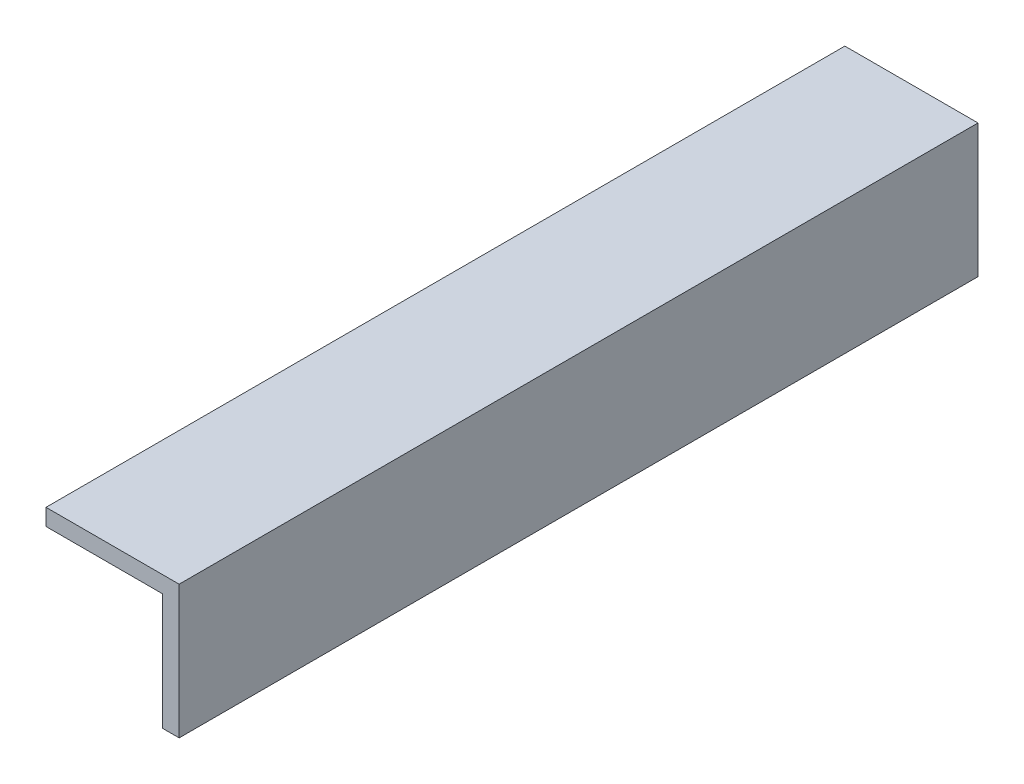
ISO-10303-21;
HEADER;
FILE_DESCRIPTION(('STEP AP214'),'2;1');
FILE_NAME('part.step','',(''),(''),'','','');
FILE_SCHEMA(('AUTOMOTIVE_DESIGN { 1 0 10303 214 1 1 1 1 }'));
ENDSEC;
DATA;
#1=APPLICATION_CONTEXT('core data for automotive mechanical design processes');
#2=APPLICATION_PROTOCOL_DEFINITION('international standard','automotive_design',2000,#1);
#3=PRODUCT_CONTEXT('',#1,'mechanical');
#4=PRODUCT('Part','Part','',(#3));
#5=PRODUCT_RELATED_PRODUCT_CATEGORY('part','',(#4));
#6=PRODUCT_DEFINITION_FORMATION('','',#4);
#7=PRODUCT_DEFINITION_CONTEXT('part definition',#1,'design');
#8=PRODUCT_DEFINITION('design','',#6,#7);
#9=PRODUCT_DEFINITION_SHAPE('','',#8);
#10=(LENGTH_UNIT() NAMED_UNIT(*) SI_UNIT(.MILLI.,.METRE.));
#11=(NAMED_UNIT(*) PLANE_ANGLE_UNIT() SI_UNIT($,.RADIAN.));
#12=(NAMED_UNIT(*) SI_UNIT($,.STERADIAN.) SOLID_ANGLE_UNIT());
#13=UNCERTAINTY_MEASURE_WITH_UNIT(LENGTH_MEASURE(1.E-05),#10,'distance_accuracy_value','');
#14=(GEOMETRIC_REPRESENTATION_CONTEXT(3) GLOBAL_UNCERTAINTY_ASSIGNED_CONTEXT((#13)) GLOBAL_UNIT_ASSIGNED_CONTEXT((#10,
#11,#12)) REPRESENTATION_CONTEXT('',''));
#15=CARTESIAN_POINT('',(0.,0.,0.));
#16=DIRECTION('',(0.,0.,1.));
#17=DIRECTION('',(1.,0.,0.));
#18=AXIS2_PLACEMENT_3D('',#15,#16,#17);
#19=CARTESIAN_POINT('',(0.,0.,152.4));
#20=DIRECTION('',(1.,0.,0.));
#21=DIRECTION('',(0.,0.,-1.));
#22=AXIS2_PLACEMENT_3D('',#19,#20,#21);
#23=PLANE('',#22);
#24=DIRECTION('',(0.,-1.,0.));
#25=VECTOR('',#24,1.);
#26=CARTESIAN_POINT('',(0.,0.,0.));
#27=LINE('',#26,#25);
#28=CARTESIAN_POINT('',(0.,0.,0.));
#29=VERTEX_POINT('',#28);
#30=CARTESIAN_POINT('',(0.,-3.175,0.));
#31=VERTEX_POINT('',#30);
#32=EDGE_CURVE('E115',#29,#31,#27,.T.);
#33=ORIENTED_EDGE('',*,*,#32,.T.);
#34=DIRECTION('',(0.,0.,-1.));
#35=VECTOR('',#34,1.);
#36=CARTESIAN_POINT('',(0.,-3.175,152.4));
#37=LINE('',#36,#35);
#38=CARTESIAN_POINT('',(0.,-3.175,152.4));
#39=VERTEX_POINT('',#38);
#40=EDGE_CURVE('E11',#39,#31,#37,.T.);
#41=ORIENTED_EDGE('',*,*,#40,.F.);
#42=DIRECTION('',(0.,-1.,0.));
#43=VECTOR('',#42,1.);
#44=CARTESIAN_POINT('',(0.,0.,152.4));
#45=LINE('',#44,#43);
#46=CARTESIAN_POINT('',(0.,0.,152.4));
#47=VERTEX_POINT('',#46);
#48=EDGE_CURVE('E80',#47,#39,#45,.T.);
#49=ORIENTED_EDGE('',*,*,#48,.F.);
#50=DIRECTION('',(0.,0.,-1.));
#51=VECTOR('',#50,1.);
#52=CARTESIAN_POINT('',(0.,0.,152.4));
#53=LINE('',#52,#51);
#54=EDGE_CURVE('E49',#47,#29,#53,.T.);
#55=ORIENTED_EDGE('',*,*,#54,.T.);
#56=EDGE_LOOP('',(#33,#41,#49,#55));
#57=FACE_BOUND('',#56,.T.);
#58=ADVANCED_FACE('F33',(#57),#23,.F.);
#59=CARTESIAN_POINT('',(22.225,-3.175,152.4));
#60=DIRECTION('',(0.,-1.,0.));
#61=DIRECTION('',(0.,0.,-1.));
#62=AXIS2_PLACEMENT_3D('',#59,#60,#61);
#63=PLANE('',#62);
#64=DIRECTION('',(-1.,0.,0.));
#65=VECTOR('',#64,1.);
#66=CARTESIAN_POINT('',(22.225,-3.175,0.));
#67=LINE('',#66,#65);
#68=CARTESIAN_POINT('',(22.225,-3.175,0.));
#69=VERTEX_POINT('',#68);
#70=EDGE_CURVE('E117',#69,#31,#67,.T.);
#71=ORIENTED_EDGE('',*,*,#70,.F.);
#72=DIRECTION('',(0.,0.,-1.));
#73=VECTOR('',#72,1.);
#74=CARTESIAN_POINT('',(22.225,-3.175,152.4));
#75=LINE('',#74,#73);
#76=CARTESIAN_POINT('',(22.225,-3.175,152.4));
#77=VERTEX_POINT('',#76);
#78=EDGE_CURVE('E41',#77,#69,#75,.T.);
#79=ORIENTED_EDGE('',*,*,#78,.F.);
#80=DIRECTION('',(-1.,0.,0.));
#81=VECTOR('',#80,1.);
#82=CARTESIAN_POINT('',(22.225,-3.175,152.4));
#83=LINE('',#82,#81);
#84=EDGE_CURVE('E154',#77,#39,#83,.T.);
#85=ORIENTED_EDGE('',*,*,#84,.T.);
#86=ORIENTED_EDGE('',*,*,#40,.T.);
#87=EDGE_LOOP('',(#71,#79,#85,#86));
#88=FACE_BOUND('',#87,.T.);
#89=ADVANCED_FACE('F137',(#88),#63,.T.);
#90=CARTESIAN_POINT('',(22.225,-25.4,152.4));
#91=DIRECTION('',(-1.,0.,0.));
#92=DIRECTION('',(0.,0.,1.));
#93=AXIS2_PLACEMENT_3D('',#90,#91,#92);
#94=PLANE('',#93);
#95=DIRECTION('',(0.,1.,0.));
#96=VECTOR('',#95,1.);
#97=CARTESIAN_POINT('',(22.225,-25.4,0.));
#98=LINE('',#97,#96);
#99=CARTESIAN_POINT('',(22.225,-25.4,0.));
#100=VERTEX_POINT('',#99);
#101=EDGE_CURVE('E120',#100,#69,#98,.T.);
#102=ORIENTED_EDGE('',*,*,#101,.F.);
#103=DIRECTION('',(0.,0.,-1.));
#104=VECTOR('',#103,1.);
#105=CARTESIAN_POINT('',(22.225,-25.4,152.4));
#106=LINE('',#105,#104);
#107=CARTESIAN_POINT('',(22.225,-25.4,152.4));
#108=VERTEX_POINT('',#107);
#109=EDGE_CURVE('E100',#108,#100,#106,.T.);
#110=ORIENTED_EDGE('',*,*,#109,.F.);
#111=DIRECTION('',(0.,1.,0.));
#112=VECTOR('',#111,1.);
#113=CARTESIAN_POINT('',(22.225,-25.4,152.4));
#114=LINE('',#113,#112);
#115=EDGE_CURVE('E107',#108,#77,#114,.T.);
#116=ORIENTED_EDGE('',*,*,#115,.T.);
#117=ORIENTED_EDGE('',*,*,#78,.T.);
#118=EDGE_LOOP('',(#102,#110,#116,#117));
#119=FACE_BOUND('',#118,.T.);
#120=ADVANCED_FACE('F134',(#119),#94,.T.);
#121=CARTESIAN_POINT('',(25.4,-25.4,152.4));
#122=DIRECTION('',(0.,-1.,0.));
#123=DIRECTION('',(0.,0.,-1.));
#124=AXIS2_PLACEMENT_3D('',#121,#122,#123);
#125=PLANE('',#124);
#126=DIRECTION('',(-1.,0.,0.));
#127=VECTOR('',#126,1.);
#128=CARTESIAN_POINT('',(25.4,-25.4,0.));
#129=LINE('',#128,#127);
#130=CARTESIAN_POINT('',(25.4,-25.4,0.));
#131=VERTEX_POINT('',#130);
#132=EDGE_CURVE('E96',#131,#100,#129,.T.);
#133=ORIENTED_EDGE('',*,*,#132,.F.);
#134=DIRECTION('',(0.,0.,-1.));
#135=VECTOR('',#134,1.);
#136=CARTESIAN_POINT('',(25.4,-25.4,152.4));
#137=LINE('',#136,#135);
#138=CARTESIAN_POINT('',(25.4,-25.4,152.4));
#139=VERTEX_POINT('',#138);
#140=EDGE_CURVE('E91',#139,#131,#137,.T.);
#141=ORIENTED_EDGE('',*,*,#140,.F.);
#142=DIRECTION('',(-1.,0.,0.));
#143=VECTOR('',#142,1.);
#144=CARTESIAN_POINT('',(25.4,-25.4,152.4));
#145=LINE('',#144,#143);
#146=EDGE_CURVE('E94',#139,#108,#145,.T.);
#147=ORIENTED_EDGE('',*,*,#146,.T.);
#148=ORIENTED_EDGE('',*,*,#109,.T.);
#149=EDGE_LOOP('',(#133,#141,#147,#148));
#150=FACE_BOUND('',#149,.T.);
#151=ADVANCED_FACE('F93',(#150),#125,.T.);
#152=CARTESIAN_POINT('',(25.4,0.,152.4));
#153=DIRECTION('',(1.,0.,0.));
#154=DIRECTION('',(0.,0.,-1.));
#155=AXIS2_PLACEMENT_3D('',#152,#153,#154);
#156=PLANE('',#155);
#157=DIRECTION('',(0.,-1.,0.));
#158=VECTOR('',#157,1.);
#159=CARTESIAN_POINT('',(25.4,0.,0.));
#160=LINE('',#159,#158);
#161=CARTESIAN_POINT('',(25.4,0.,0.));
#162=VERTEX_POINT('',#161);
#163=EDGE_CURVE('E124',#162,#131,#160,.T.);
#164=ORIENTED_EDGE('',*,*,#163,.F.);
#165=DIRECTION('',(0.,0.,-1.));
#166=VECTOR('',#165,1.);
#167=CARTESIAN_POINT('',(25.4,0.,152.4));
#168=LINE('',#167,#166);
#169=CARTESIAN_POINT('',(25.4,0.,152.4));
#170=VERTEX_POINT('',#169);
#171=EDGE_CURVE('E68',#170,#162,#168,.T.);
#172=ORIENTED_EDGE('',*,*,#171,.F.);
#173=DIRECTION('',(0.,-1.,0.));
#174=VECTOR('',#173,1.);
#175=CARTESIAN_POINT('',(25.4,0.,152.4));
#176=LINE('',#175,#174);
#177=EDGE_CURVE('E105',#170,#139,#176,.T.);
#178=ORIENTED_EDGE('',*,*,#177,.T.);
#179=ORIENTED_EDGE('',*,*,#140,.T.);
#180=EDGE_LOOP('',(#164,#172,#178,#179));
#181=FACE_BOUND('',#180,.T.);
#182=ADVANCED_FACE('F109',(#181),#156,.T.);
#183=CARTESIAN_POINT('',(0.,0.,152.4));
#184=DIRECTION('',(0.,1.,0.));
#185=DIRECTION('',(0.,0.,1.));
#186=AXIS2_PLACEMENT_3D('',#183,#184,#185);
#187=PLANE('',#186);
#188=DIRECTION('',(1.,0.,0.));
#189=VECTOR('',#188,1.);
#190=CARTESIAN_POINT('',(0.,0.,0.));
#191=LINE('',#190,#189);
#192=EDGE_CURVE('E126',#29,#162,#191,.T.);
#193=ORIENTED_EDGE('',*,*,#192,.F.);
#194=ORIENTED_EDGE('',*,*,#54,.F.);
#195=DIRECTION('',(1.,0.,0.));
#196=VECTOR('',#195,1.);
#197=CARTESIAN_POINT('',(0.,0.,152.4));
#198=LINE('',#197,#196);
#199=EDGE_CURVE('E110',#47,#170,#198,.T.);
#200=ORIENTED_EDGE('',*,*,#199,.T.);
#201=ORIENTED_EDGE('',*,*,#171,.T.);
#202=EDGE_LOOP('',(#193,#194,#200,#201));
#203=FACE_BOUND('',#202,.T.);
#204=ADVANCED_FACE('F140',(#203),#187,.T.);
#205=CARTESIAN_POINT('',(0.,0.,152.4));
#206=DIRECTION('',(0.,0.,-1.));
#207=DIRECTION('',(-1.,0.,0.));
#208=AXIS2_PLACEMENT_3D('',#205,#206,#207);
#209=PLANE('',#208);
#210=ORIENTED_EDGE('',*,*,#48,.T.);
#211=ORIENTED_EDGE('',*,*,#84,.F.);
#212=ORIENTED_EDGE('',*,*,#115,.F.);
#213=ORIENTED_EDGE('',*,*,#146,.F.);
#214=ORIENTED_EDGE('',*,*,#177,.F.);
#215=ORIENTED_EDGE('',*,*,#199,.F.);
#216=EDGE_LOOP('',(#210,#211,#212,#213,#214,#215));
#217=FACE_BOUND('',#216,.T.);
#218=ADVANCED_FACE('F104',(#217),#209,.F.);
#219=CARTESIAN_POINT('',(0.,0.,0.));
#220=DIRECTION('',(0.,0.,-1.));
#221=DIRECTION('',(-1.,0.,0.));
#222=AXIS2_PLACEMENT_3D('',#219,#220,#221);
#223=PLANE('',#222);
#224=ORIENTED_EDGE('',*,*,#32,.F.);
#225=ORIENTED_EDGE('',*,*,#192,.T.);
#226=ORIENTED_EDGE('',*,*,#163,.T.);
#227=ORIENTED_EDGE('',*,*,#132,.T.);
#228=ORIENTED_EDGE('',*,*,#101,.T.);
#229=ORIENTED_EDGE('',*,*,#70,.T.);
#230=EDGE_LOOP('',(#224,#225,#226,#227,#228,#229));
#231=FACE_BOUND('',#230,.T.);
#232=ADVANCED_FACE('F139',(#231),#223,.T.);
#233=CLOSED_SHELL('',(#58,#89,#120,#151,#182,#204,#218,#232));
#234=MANIFOLD_SOLID_BREP('B2',#233);
#235=ADVANCED_BREP_SHAPE_REPRESENTATION('',(#18,#234),#14);
#236=SHAPE_DEFINITION_REPRESENTATION(#9,#235);
ENDSEC;
END-ISO-10303-21;
